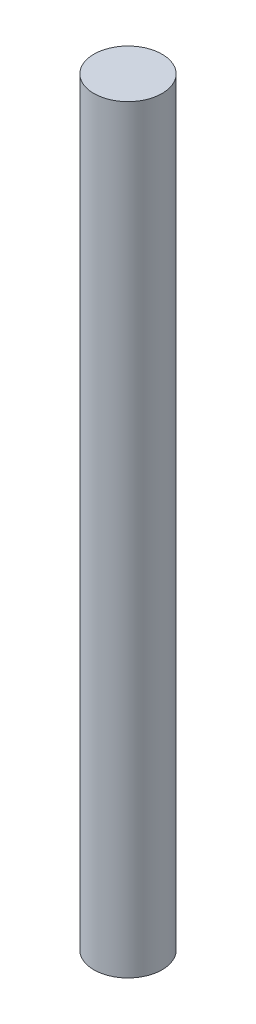
ISO-10303-21;
HEADER;
FILE_DESCRIPTION(('STEP AP214'),'2;1');
FILE_NAME('part.step','',(''),(''),'','','');
FILE_SCHEMA(('AUTOMOTIVE_DESIGN { 1 0 10303 214 1 1 1 1 }'));
ENDSEC;
DATA;
#1=APPLICATION_CONTEXT('core data for automotive mechanical design processes');
#2=APPLICATION_PROTOCOL_DEFINITION('international standard','automotive_design',2000,#1);
#3=PRODUCT_CONTEXT('',#1,'mechanical');
#4=PRODUCT('Part','Part','',(#3));
#5=PRODUCT_RELATED_PRODUCT_CATEGORY('part','',(#4));
#6=PRODUCT_DEFINITION_FORMATION('','',#4);
#7=PRODUCT_DEFINITION_CONTEXT('part definition',#1,'design');
#8=PRODUCT_DEFINITION('design','',#6,#7);
#9=PRODUCT_DEFINITION_SHAPE('','',#8);
#10=(LENGTH_UNIT() NAMED_UNIT(*) SI_UNIT(.MILLI.,.METRE.));
#11=(NAMED_UNIT(*) PLANE_ANGLE_UNIT() SI_UNIT($,.RADIAN.));
#12=(NAMED_UNIT(*) SI_UNIT($,.STERADIAN.) SOLID_ANGLE_UNIT());
#13=UNCERTAINTY_MEASURE_WITH_UNIT(LENGTH_MEASURE(1.E-05),#10,'distance_accuracy_value','');
#14=(GEOMETRIC_REPRESENTATION_CONTEXT(3) GLOBAL_UNCERTAINTY_ASSIGNED_CONTEXT((#13)) GLOBAL_UNIT_ASSIGNED_CONTEXT((#10,
#11,#12)) REPRESENTATION_CONTEXT('',''));
#15=CARTESIAN_POINT('',(0.,0.,0.));
#16=DIRECTION('',(0.,0.,1.));
#17=DIRECTION('',(1.,0.,0.));
#18=AXIS2_PLACEMENT_3D('',#15,#16,#17);
#19=CARTESIAN_POINT('',(0.,33.4,0.));
#20=DIRECTION('',(0.,-1.,0.));
#21=DIRECTION('',(0.,0.,-1.));
#22=AXIS2_PLACEMENT_3D('',#19,#20,#21);
#23=CYLINDRICAL_SURFACE('',#22,1.5);
#24=CARTESIAN_POINT('',(0.,33.4,0.));
#25=DIRECTION('',(0.,1.,0.));
#26=DIRECTION('',(0.,0.,1.));
#27=AXIS2_PLACEMENT_3D('',#24,#25,#26);
#28=CIRCLE('',#27,1.5);
#29=CARTESIAN_POINT('',(0.,33.4,1.5));
#30=VERTEX_POINT('',#29);
#31=EDGE_CURVE('E10',#30,#30,#28,.T.);
#32=ORIENTED_EDGE('',*,*,#31,.F.);
#33=EDGE_LOOP('',(#32));
#34=FACE_BOUND('',#33,.T.);
#35=CARTESIAN_POINT('',(0.,0.,0.));
#36=DIRECTION('',(0.,1.,0.));
#37=DIRECTION('',(0.,0.,1.));
#38=AXIS2_PLACEMENT_3D('',#35,#36,#37);
#39=CIRCLE('',#38,1.5);
#40=CARTESIAN_POINT('',(0.,0.,1.5));
#41=VERTEX_POINT('',#40);
#42=EDGE_CURVE('E34',#41,#41,#39,.T.);
#43=ORIENTED_EDGE('',*,*,#42,.T.);
#44=EDGE_LOOP('',(#43));
#45=FACE_BOUND('',#44,.T.);
#46=ADVANCED_FACE('F31',(#34,#45),#23,.T.);
#47=CARTESIAN_POINT('',(0.,33.4,0.));
#48=DIRECTION('',(0.,1.,0.));
#49=DIRECTION('',(0.,0.,1.));
#50=AXIS2_PLACEMENT_3D('',#47,#48,#49);
#51=PLANE('',#50);
#52=ORIENTED_EDGE('',*,*,#31,.T.);
#53=EDGE_LOOP('',(#52));
#54=FACE_BOUND('',#53,.T.);
#55=ADVANCED_FACE('F46',(#54),#51,.T.);
#56=CARTESIAN_POINT('',(0.,0.,0.));
#57=DIRECTION('',(0.,1.,0.));
#58=DIRECTION('',(0.,0.,1.));
#59=AXIS2_PLACEMENT_3D('',#56,#57,#58);
#60=PLANE('',#59);
#61=ORIENTED_EDGE('',*,*,#42,.F.);
#62=EDGE_LOOP('',(#61));
#63=FACE_BOUND('',#62,.T.);
#64=ADVANCED_FACE('F44',(#63),#60,.F.);
#65=CLOSED_SHELL('',(#46,#55,#64));
#66=MANIFOLD_SOLID_BREP('B2',#65);
#67=ADVANCED_BREP_SHAPE_REPRESENTATION('',(#18,#66),#14);
#68=SHAPE_DEFINITION_REPRESENTATION(#9,#67);
ENDSEC;
END-ISO-10303-21;
